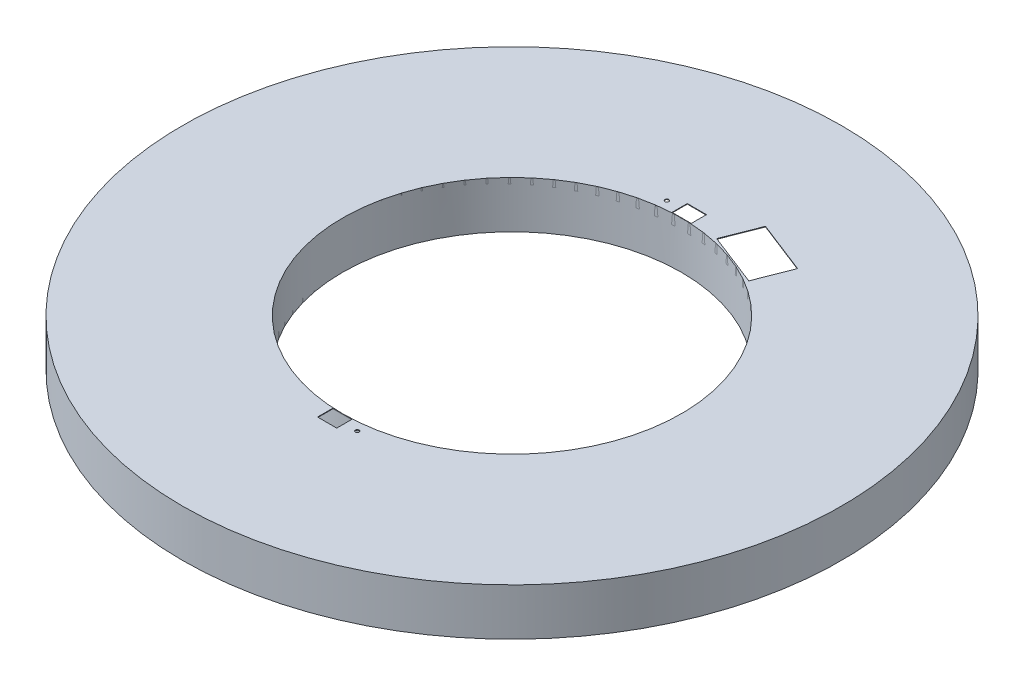
ISO-10303-21;
HEADER;
FILE_DESCRIPTION(('STEP AP214'),'2;1');
FILE_NAME('part.step','',(''),(''),'','','');
FILE_SCHEMA(('AUTOMOTIVE_DESIGN { 1 0 10303 214 1 1 1 1 }'));
ENDSEC;
DATA;
#1=APPLICATION_CONTEXT('core data for automotive mechanical design processes');
#2=APPLICATION_PROTOCOL_DEFINITION('international standard','automotive_design',2000,#1);
#3=PRODUCT_CONTEXT('',#1,'mechanical');
#4=PRODUCT('Part','Part','',(#3));
#5=PRODUCT_RELATED_PRODUCT_CATEGORY('part','',(#4));
#6=PRODUCT_DEFINITION_FORMATION('','',#4);
#7=PRODUCT_DEFINITION_CONTEXT('part definition',#1,'design');
#8=PRODUCT_DEFINITION('design','',#6,#7);
#9=PRODUCT_DEFINITION_SHAPE('','',#8);
#10=(LENGTH_UNIT() NAMED_UNIT(*) SI_UNIT(.MILLI.,.METRE.));
#11=(NAMED_UNIT(*) PLANE_ANGLE_UNIT() SI_UNIT($,.RADIAN.));
#12=(NAMED_UNIT(*) SI_UNIT($,.STERADIAN.) SOLID_ANGLE_UNIT());
#13=UNCERTAINTY_MEASURE_WITH_UNIT(LENGTH_MEASURE(1.E-05),#10,'distance_accuracy_value','');
#14=(GEOMETRIC_REPRESENTATION_CONTEXT(3) GLOBAL_UNCERTAINTY_ASSIGNED_CONTEXT((#13)) GLOBAL_UNIT_ASSIGNED_CONTEXT((#10,
#11,#12)) REPRESENTATION_CONTEXT('',''));
#15=CARTESIAN_POINT('',(0.,0.,0.));
#16=DIRECTION('',(0.,0.,1.));
#17=DIRECTION('',(1.,0.,0.));
#18=AXIS2_PLACEMENT_3D('',#15,#16,#17);
#19=CARTESIAN_POINT('',(0.,497.,0.));
#20=DIRECTION('',(0.,-1.,0.));
#21=DIRECTION('',(0.,0.,-1.));
#22=AXIS2_PLACEMENT_3D('',#19,#20,#21);
#23=CYLINDRICAL_SURFACE('',#22,1748.5);
#24=CARTESIAN_POINT('',(0.,497.,0.));
#25=DIRECTION('',(0.,-1.,0.));
#26=DIRECTION('',(0.,0.,-1.));
#27=AXIS2_PLACEMENT_3D('',#24,#25,#26);
#28=CIRCLE('',#27,1748.5);
#29=CARTESIAN_POINT('',(0.,497.,-1748.5));
#30=VERTEX_POINT('',#29);
#31=EDGE_CURVE('E252',#30,#30,#28,.T.);
#32=CARTESIAN_POINT('',(0.,250.,0.));
#33=DIRECTION('',(0.,-1.,0.));
#34=DIRECTION('',(0.,0.,-1.));
#35=AXIS2_PLACEMENT_3D('',#32,#33,#34);
#36=CIRCLE('',#35,1748.5);
#37=CARTESIAN_POINT('',(0.,250.,-1748.5));
#38=VERTEX_POINT('',#37);
#39=EDGE_CURVE('E235',#38,#38,#36,.F.);
#40=CARTESIAN_POINT('',(0.,497.,-1748.5));
#41=CARTESIAN_POINT('',(0.,494.427083333333,-1748.5));
#42=CARTESIAN_POINT('',(0.,491.854166666667,-1748.5));
#43=CARTESIAN_POINT('',(0.,486.708333333333,-1748.5));
#44=CARTESIAN_POINT('',(0.,484.135416666667,-1748.5));
#45=CARTESIAN_POINT('',(0.,478.989583333333,-1748.5));
#46=CARTESIAN_POINT('',(0.,476.416666666667,-1748.5));
#47=CARTESIAN_POINT('',(0.,471.270833333333,-1748.5));
#48=CARTESIAN_POINT('',(0.,468.697916666667,-1748.5));
#49=CARTESIAN_POINT('',(0.,463.552083333333,-1748.5));
#50=CARTESIAN_POINT('',(0.,460.979166666667,-1748.5));
#51=CARTESIAN_POINT('',(0.,455.833333333333,-1748.5));
#52=CARTESIAN_POINT('',(0.,453.260416666667,-1748.5));
#53=CARTESIAN_POINT('',(0.,448.114583333333,-1748.5));
#54=CARTESIAN_POINT('',(0.,445.541666666667,-1748.5));
#55=CARTESIAN_POINT('',(0.,440.395833333333,-1748.5));
#56=CARTESIAN_POINT('',(0.,437.822916666667,-1748.5));
#57=CARTESIAN_POINT('',(0.,432.677083333333,-1748.5));
#58=CARTESIAN_POINT('',(0.,430.104166666667,-1748.5));
#59=CARTESIAN_POINT('',(0.,424.958333333333,-1748.5));
#60=CARTESIAN_POINT('',(0.,422.385416666667,-1748.5));
#61=CARTESIAN_POINT('',(0.,417.239583333333,-1748.5));
#62=CARTESIAN_POINT('',(0.,414.666666666667,-1748.5));
#63=CARTESIAN_POINT('',(0.,409.520833333333,-1748.5));
#64=CARTESIAN_POINT('',(0.,406.947916666667,-1748.5));
#65=CARTESIAN_POINT('',(0.,401.802083333333,-1748.5));
#66=CARTESIAN_POINT('',(0.,399.229166666667,-1748.5));
#67=CARTESIAN_POINT('',(0.,394.083333333333,-1748.5));
#68=CARTESIAN_POINT('',(0.,391.510416666667,-1748.5));
#69=CARTESIAN_POINT('',(0.,386.364583333333,-1748.5));
#70=CARTESIAN_POINT('',(0.,383.791666666667,-1748.5));
#71=CARTESIAN_POINT('',(0.,378.645833333333,-1748.5));
#72=CARTESIAN_POINT('',(0.,376.072916666667,-1748.5));
#73=CARTESIAN_POINT('',(0.,370.927083333333,-1748.5));
#74=CARTESIAN_POINT('',(0.,368.354166666667,-1748.5));
#75=CARTESIAN_POINT('',(0.,363.208333333333,-1748.5));
#76=CARTESIAN_POINT('',(0.,360.635416666667,-1748.5));
#77=CARTESIAN_POINT('',(0.,355.489583333333,-1748.5));
#78=CARTESIAN_POINT('',(0.,352.916666666667,-1748.5));
#79=CARTESIAN_POINT('',(0.,347.770833333333,-1748.5));
#80=CARTESIAN_POINT('',(0.,345.197916666667,-1748.5));
#81=CARTESIAN_POINT('',(0.,340.052083333333,-1748.5));
#82=CARTESIAN_POINT('',(0.,337.479166666667,-1748.5));
#83=CARTESIAN_POINT('',(0.,332.333333333333,-1748.5));
#84=CARTESIAN_POINT('',(0.,329.760416666667,-1748.5));
#85=CARTESIAN_POINT('',(0.,324.614583333333,-1748.5));
#86=CARTESIAN_POINT('',(0.,322.041666666667,-1748.5));
#87=CARTESIAN_POINT('',(0.,316.895833333333,-1748.5));
#88=CARTESIAN_POINT('',(0.,314.322916666667,-1748.5));
#89=CARTESIAN_POINT('',(0.,309.177083333333,-1748.5));
#90=CARTESIAN_POINT('',(0.,306.604166666667,-1748.5));
#91=CARTESIAN_POINT('',(0.,301.458333333333,-1748.5));
#92=CARTESIAN_POINT('',(0.,298.885416666667,-1748.5));
#93=CARTESIAN_POINT('',(0.,293.739583333333,-1748.5));
#94=CARTESIAN_POINT('',(0.,291.166666666667,-1748.5));
#95=CARTESIAN_POINT('',(0.,286.020833333333,-1748.5));
#96=CARTESIAN_POINT('',(0.,283.447916666667,-1748.5));
#97=CARTESIAN_POINT('',(0.,278.302083333333,-1748.5));
#98=CARTESIAN_POINT('',(0.,275.729166666667,-1748.5));
#99=CARTESIAN_POINT('',(0.,270.583333333333,-1748.5));
#100=CARTESIAN_POINT('',(0.,268.010416666667,-1748.5));
#101=CARTESIAN_POINT('',(0.,262.864583333333,-1748.5));
#102=CARTESIAN_POINT('',(0.,260.291666666667,-1748.5));
#103=CARTESIAN_POINT('',(0.,255.145833333333,-1748.5));
#104=CARTESIAN_POINT('',(0.,252.572916666667,-1748.5));
#105=CARTESIAN_POINT('',(0.,250.,-1748.5));
#106=B_SPLINE_CURVE_WITH_KNOTS('',3,(#40,#41,#42,#43,#44,#45,#46,#47,#48,#49,#50,#51,#52,#53,
#54,#55,#56,#57,#58,#59,#60,#61,#62,#63,#64,#65,#66,#67,#68,#69,#70,#71,#72,#73,#74,#75,#76,#77,
#78,#79,#80,#81,#82,#83,#84,#85,#86,#87,#88,#89,#90,#91,#92,#93,#94,#95,#96,#97,#98,#99,#100,
#101,#102,#103,#104,#105),.UNSPECIFIED.,.F.,.F.,(4,2,2,2,2,2,2,2,2,2,2,2,2,2,2,2,2,2,2,2,2,2,2,
2,2,2,2,2,2,2,2,2,4),(0.,7.71875,15.4375,23.15625,30.875,38.59375,46.3125,54.03125,61.75,
69.46875,77.1875,84.90625,92.625,100.34375,108.0625,115.78125,123.5,131.21875,138.9375,
146.65625,154.375,162.09375,169.8125,177.53125,185.25,192.96875,200.6875,208.40625,216.125,
223.84375,231.5625,239.28125,247.),.UNSPECIFIED.);
#107=EDGE_CURVE('BSEAM38',#30,#38,#106,.T.);
#108=ORIENTED_EDGE('',*,*,#31,.F.);
#109=ORIENTED_EDGE('',*,*,#39,.F.);
#110=ORIENTED_EDGE('',*,*,#107,.T.);
#111=ORIENTED_EDGE('',*,*,#107,.F.);
#112=EDGE_LOOP('',(#108,#110,#109,#111));
#113=FACE_BOUND('',#112,.T.);
#114=ADVANCED_FACE('F38',(#113),#23,.F.);
#115=CARTESIAN_POINT('',(0.,497.,0.));
#116=DIRECTION('',(0.,-1.,0.));
#117=DIRECTION('',(0.,0.,-1.));
#118=AXIS2_PLACEMENT_3D('',#115,#116,#117);
#119=PLANE('',#118);
#120=DIRECTION('',(0.363730258472807,0.,-0.93150432047914));
#121=VECTOR('',#120,1.);
#122=CARTESIAN_POINT('',(188.594951023723,497.,-898.445391682458));
#123=LINE('',#122,#121);
#124=CARTESIAN_POINT('',(188.594951023723,497.,-898.445391682458));
#125=VERTEX_POINT('',#124);
#126=CARTESIAN_POINT('',(261.341002718284,497.,-1084.74625577829));
#127=VERTEX_POINT('',#126);
#128=EDGE_CURVE('E54',#125,#127,#123,.T.);
#129=ORIENTED_EDGE('',*,*,#128,.F.);
#130=DIRECTION('',(-0.93150432047914,0.,-0.363730258472807));
#131=VECTOR('',#130,1.);
#132=CARTESIAN_POINT('',(188.594951023723,497.,-898.445391682458));
#133=LINE('',#132,#131);
#134=CARTESIAN_POINT('',(468.046247167465,497.,-789.326314140616));
#135=VERTEX_POINT('',#134);
#136=EDGE_CURVE('E154',#135,#125,#133,.T.);
#137=ORIENTED_EDGE('',*,*,#136,.F.);
#138=DIRECTION('',(-0.363730258472807,0.,0.93150432047914));
#139=VECTOR('',#138,1.);
#140=CARTESIAN_POINT('',(468.046247167465,497.,-789.326314140616));
#141=LINE('',#140,#139);
#142=CARTESIAN_POINT('',(540.792298862026,497.,-975.627178236444));
#143=VERTEX_POINT('',#142);
#144=EDGE_CURVE('E136',#143,#135,#141,.T.);
#145=ORIENTED_EDGE('',*,*,#144,.F.);
#146=DIRECTION('',(0.93150432047914,0.,0.363730258472807));
#147=VECTOR('',#146,1.);
#148=CARTESIAN_POINT('',(261.341002718284,497.,-1084.74625577829));
#149=LINE('',#148,#147);
#150=EDGE_CURVE('E146',#127,#143,#149,.T.);
#151=ORIENTED_EDGE('',*,*,#150,.F.);
#152=EDGE_LOOP('',(#129,#137,#145,#151));
#153=FACE_BOUND('',#152,.T.);
#154=CARTESIAN_POINT('',(-118.818630958089,497.,-941.25));
#155=DIRECTION('',(0.,-1.,0.));
#156=DIRECTION('',(0.,0.,-1.));
#157=AXIS2_PLACEMENT_3D('',#154,#155,#156);
#158=CIRCLE('',#157,10.);
#159=CARTESIAN_POINT('',(-118.818630958089,497.,-951.25));
#160=VERTEX_POINT('',#159);
#161=EDGE_CURVE('E169',#160,#160,#158,.T.);
#162=ORIENTED_EDGE('',*,*,#161,.F.);
#163=EDGE_LOOP('',(#162));
#164=FACE_BOUND('',#163,.T.);
#165=CARTESIAN_POINT('',(119.300731454828,497.,941.189016636456));
#166=DIRECTION('',(0.,-1.,0.));
#167=DIRECTION('',(0.,0.,-1.));
#168=AXIS2_PLACEMENT_3D('',#165,#166,#167);
#169=CIRCLE('',#168,10.);
#170=CARTESIAN_POINT('',(119.300731454828,497.,931.189016636456));
#171=VERTEX_POINT('',#170);
#172=EDGE_CURVE('E164',#171,#171,#169,.T.);
#173=ORIENTED_EDGE('',*,*,#172,.F.);
#174=EDGE_LOOP('',(#173));
#175=FACE_BOUND('',#174,.T.);
#176=DIRECTION('',(0.,0.,1.));
#177=VECTOR('',#176,1.);
#178=CARTESIAN_POINT('',(51.,497.,-981.75));
#179=LINE('',#178,#177);
#180=CARTESIAN_POINT('',(51.,497.,-981.75));
#181=VERTEX_POINT('',#180);
#182=CARTESIAN_POINT('',(51.,497.,-900.75));
#183=VERTEX_POINT('',#182);
#184=EDGE_CURVE('E189',#181,#183,#179,.T.);
#185=ORIENTED_EDGE('',*,*,#184,.F.);
#186=DIRECTION('',(1.,0.,0.));
#187=VECTOR('',#186,1.);
#188=CARTESIAN_POINT('',(-51.,497.,-981.75));
#189=LINE('',#188,#187);
#190=CARTESIAN_POINT('',(-51.,497.,-981.75));
#191=VERTEX_POINT('',#190);
#192=EDGE_CURVE('E185',#191,#181,#189,.T.);
#193=ORIENTED_EDGE('',*,*,#192,.F.);
#194=DIRECTION('',(0.,0.,-1.));
#195=VECTOR('',#194,1.);
#196=CARTESIAN_POINT('',(-51.,497.,-900.75));
#197=LINE('',#196,#195);
#198=CARTESIAN_POINT('',(-51.,497.,-900.75));
#199=VERTEX_POINT('',#198);
#200=EDGE_CURVE('E180',#199,#191,#197,.T.);
#201=ORIENTED_EDGE('',*,*,#200,.F.);
#202=DIRECTION('',(-1.,0.,0.));
#203=VECTOR('',#202,1.);
#204=CARTESIAN_POINT('',(0.,497.,-900.75));
#205=LINE('',#204,#203);
#206=CARTESIAN_POINT('',(0.,497.,-900.75));
#207=VERTEX_POINT('',#206);
#208=EDGE_CURVE('E181',#207,#199,#205,.T.);
#209=ORIENTED_EDGE('',*,*,#208,.F.);
#210=CARTESIAN_POINT('',(0.,497.,0.));
#211=DIRECTION('',(0.,-1.,0.));
#212=DIRECTION('',(0.,0.,-1.));
#213=AXIS2_PLACEMENT_3D('',#210,#211,#212);
#214=CIRCLE('',#213,900.75);
#215=CARTESIAN_POINT('',(0.,497.,900.75));
#216=VERTEX_POINT('',#215);
#217=EDGE_CURVE('E248',#216,#207,#214,.T.);
#218=ORIENTED_EDGE('',*,*,#217,.F.);
#219=DIRECTION('',(1.,0.,0.));
#220=VECTOR('',#219,1.);
#221=CARTESIAN_POINT('',(0.,497.,900.75));
#222=LINE('',#221,#220);
#223=CARTESIAN_POINT('',(-51.,497.,900.75));
#224=VERTEX_POINT('',#223);
#225=EDGE_CURVE('E206',#224,#216,#222,.T.);
#226=ORIENTED_EDGE('',*,*,#225,.F.);
#227=DIRECTION('',(0.,0.,-1.));
#228=VECTOR('',#227,1.);
#229=CARTESIAN_POINT('',(-51.,497.,981.75));
#230=LINE('',#229,#228);
#231=CARTESIAN_POINT('',(-51.,497.,981.75));
#232=VERTEX_POINT('',#231);
#233=EDGE_CURVE('E217',#232,#224,#230,.T.);
#234=ORIENTED_EDGE('',*,*,#233,.F.);
#235=DIRECTION('',(-1.,0.,0.));
#236=VECTOR('',#235,1.);
#237=CARTESIAN_POINT('',(51.,497.,981.75));
#238=LINE('',#237,#236);
#239=CARTESIAN_POINT('',(51.,497.,981.75));
#240=VERTEX_POINT('',#239);
#241=EDGE_CURVE('E213',#240,#232,#238,.T.);
#242=ORIENTED_EDGE('',*,*,#241,.F.);
#243=DIRECTION('',(0.,0.,1.));
#244=VECTOR('',#243,1.);
#245=CARTESIAN_POINT('',(51.,497.,900.75));
#246=LINE('',#245,#244);
#247=CARTESIAN_POINT('',(51.,497.,900.75));
#248=VERTEX_POINT('',#247);
#249=EDGE_CURVE('E210',#248,#240,#246,.T.);
#250=ORIENTED_EDGE('',*,*,#249,.F.);
#251=EDGE_CURVE('E197',#216,#248,#222,.T.);
#252=ORIENTED_EDGE('',*,*,#251,.F.);
#253=EDGE_CURVE('E247',#207,#216,#214,.T.);
#254=ORIENTED_EDGE('',*,*,#253,.F.);
#255=EDGE_CURVE('E177',#183,#207,#205,.T.);
#256=ORIENTED_EDGE('',*,*,#255,.F.);
#257=EDGE_LOOP('',(#185,#193,#201,#209,#218,#226,#234,#242,#250,#252,#254,#256));
#258=FACE_BOUND('',#257,.T.);
#259=ORIENTED_EDGE('',*,*,#31,.T.);
#260=EDGE_LOOP('',(#259));
#261=FACE_BOUND('',#260,.T.);
#262=ADVANCED_FACE('F151',(#153,#164,#175,#258,#261),#119,.T.);
#263=CARTESIAN_POINT('',(0.,497.,0.));
#264=DIRECTION('',(0.,-1.,0.));
#265=DIRECTION('',(0.,0.,-1.));
#266=AXIS2_PLACEMENT_3D('',#263,#264,#265);
#267=CYLINDRICAL_SURFACE('',#266,900.75);
#268=ORIENTED_EDGE('',*,*,#217,.T.);
#269=ORIENTED_EDGE('',*,*,#253,.T.);
#270=EDGE_LOOP('',(#268,#269));
#271=FACE_BOUND('',#270,.T.);
#272=CARTESIAN_POINT('',(0.,250.,0.));
#273=DIRECTION('',(0.,-1.,0.));
#274=DIRECTION('',(0.,0.,-1.));
#275=AXIS2_PLACEMENT_3D('',#272,#273,#274);
#276=CIRCLE('',#275,900.75);
#277=CARTESIAN_POINT('',(0.,250.,-900.75));
#278=VERTEX_POINT('',#277);
#279=EDGE_CURVE('E225',#278,#278,#276,.F.);
#280=ORIENTED_EDGE('',*,*,#279,.T.);
#281=EDGE_LOOP('',(#280));
#282=FACE_BOUND('',#281,.T.);
#283=ADVANCED_FACE('F334',(#271,#282),#267,.T.);
#284=CARTESIAN_POINT('',(0.,250.,-1750.));
#285=DIRECTION('',(0.,-1.,0.));
#286=DIRECTION('',(0.,0.,-1.));
#287=AXIS2_PLACEMENT_3D('',#284,#285,#286);
#288=PLANE('',#287);
#289=ORIENTED_EDGE('',*,*,#279,.F.);
#290=EDGE_LOOP('',(#289));
#291=FACE_BOUND('',#290,.T.);
#292=CARTESIAN_POINT('',(0.,250.,0.));
#293=DIRECTION('',(0.,-1.,0.));
#294=DIRECTION('',(0.,0.,-1.));
#295=AXIS2_PLACEMENT_3D('',#292,#293,#294);
#296=CIRCLE('',#295,900.);
#297=CARTESIAN_POINT('',(0.,250.,-900.));
#298=VERTEX_POINT('',#297);
#299=EDGE_CURVE('E239',#298,#298,#296,.F.);
#300=ORIENTED_EDGE('',*,*,#299,.T.);
#301=EDGE_LOOP('',(#300));
#302=FACE_BOUND('',#301,.T.);
#303=ADVANCED_FACE('F371',(#291,#302),#288,.T.);
#304=ORIENTED_EDGE('',*,*,#39,.T.);
#305=EDGE_LOOP('',(#304));
#306=FACE_BOUND('',#305,.T.);
#307=CARTESIAN_POINT('',(0.,250.,0.));
#308=DIRECTION('',(0.,-1.,0.));
#309=DIRECTION('',(0.,0.,-1.));
#310=AXIS2_PLACEMENT_3D('',#307,#308,#309);
#311=CIRCLE('',#310,1750.);
#312=CARTESIAN_POINT('',(0.,250.,-1750.));
#313=VERTEX_POINT('',#312);
#314=EDGE_CURVE('E243',#313,#313,#311,.T.);
#315=ORIENTED_EDGE('',*,*,#314,.T.);
#316=EDGE_LOOP('',(#315));
#317=FACE_BOUND('',#316,.T.);
#318=ADVANCED_FACE('F369',(#306,#317),#288,.T.);
#319=CARTESIAN_POINT('',(0.,500.,0.));
#320=DIRECTION('',(0.,-1.,0.));
#321=DIRECTION('',(0.,0.,-1.));
#322=AXIS2_PLACEMENT_3D('',#319,#320,#321);
#323=CYLINDRICAL_SURFACE('',#322,1750.);
#324=CARTESIAN_POINT('',(0.,500.,0.));
#325=DIRECTION('',(0.,1.,0.));
#326=DIRECTION('',(0.,0.,1.));
#327=AXIS2_PLACEMENT_3D('',#324,#325,#326);
#328=CIRCLE('',#327,1750.);
#329=CARTESIAN_POINT('',(0.,500.,1750.));
#330=VERTEX_POINT('',#329);
#331=EDGE_CURVE('E260',#330,#330,#328,.T.);
#332=ORIENTED_EDGE('',*,*,#331,.F.);
#333=EDGE_LOOP('',(#332));
#334=FACE_BOUND('',#333,.T.);
#335=ORIENTED_EDGE('',*,*,#314,.F.);
#336=EDGE_LOOP('',(#335));
#337=FACE_BOUND('',#336,.T.);
#338=ADVANCED_FACE('F40',(#334,#337),#323,.T.);
#339=CARTESIAN_POINT('',(0.,200.,0.));
#340=DIRECTION('',(0.,1.,0.));
#341=DIRECTION('',(0.,0.,1.));
#342=AXIS2_PLACEMENT_3D('',#339,#340,#341);
#343=CYLINDRICAL_SURFACE('',#342,900.);
#344=CARTESIAN_POINT('',(0.,500.,0.));
#345=DIRECTION('',(0.,1.,0.));
#346=DIRECTION('',(0.,0.,1.));
#347=AXIS2_PLACEMENT_3D('',#344,#345,#346);
#348=CIRCLE('',#347,900.);
#349=CARTESIAN_POINT('',(0.,500.,900.));
#350=VERTEX_POINT('',#349);
#351=EDGE_CURVE('E256',#350,#350,#348,.T.);
#352=ORIENTED_EDGE('',*,*,#351,.T.);
#353=EDGE_LOOP('',(#352));
#354=FACE_BOUND('',#353,.T.);
#355=ORIENTED_EDGE('',*,*,#299,.F.);
#356=EDGE_LOOP('',(#355));
#357=FACE_BOUND('',#356,.T.);
#358=ADVANCED_FACE('F340',(#354,#357),#343,.F.);
#359=CARTESIAN_POINT('',(0.,500.,0.));
#360=DIRECTION('',(0.,1.,0.));
#361=DIRECTION('',(0.,0.,1.));
#362=AXIS2_PLACEMENT_3D('',#359,#360,#361);
#363=PLANE('',#362);
#364=DIRECTION('',(-0.363730258472807,0.,0.93150432047914));
#365=VECTOR('',#364,1.);
#366=CARTESIAN_POINT('',(-140.764054474771,500.,-54.9650117472916));
#367=LINE('',#366,#365);
#368=CARTESIAN_POINT('',(261.341002718284,500.,-1084.74625577829));
#369=VERTEX_POINT('',#368);
#370=CARTESIAN_POINT('',(188.594951023723,500.,-898.445391682458));
#371=VERTEX_POINT('',#370);
#372=EDGE_CURVE('E11',#369,#371,#367,.T.);
#373=ORIENTED_EDGE('',*,*,#372,.F.);
#374=DIRECTION('',(-0.93150432047914,0.,-0.363730258472807));
#375=VECTOR('',#374,1.);
#376=CARTESIAN_POINT('',(402.105057193055,500.,-1029.78124403099));
#377=LINE('',#376,#375);
#378=CARTESIAN_POINT('',(540.792298862026,500.,-975.627178236444));
#379=VERTEX_POINT('',#378);
#380=EDGE_CURVE('E293',#379,#369,#377,.T.);
#381=ORIENTED_EDGE('',*,*,#380,.F.);
#382=DIRECTION('',(0.363730258472807,0.,-0.93150432047914));
#383=VECTOR('',#382,1.);
#384=CARTESIAN_POINT('',(138.687241668971,500.,54.1540657945506));
#385=LINE('',#384,#383);
#386=CARTESIAN_POINT('',(468.046247167465,500.,-789.326314140616));
#387=VERTEX_POINT('',#386);
#388=EDGE_CURVE('E139',#387,#379,#385,.T.);
#389=ORIENTED_EDGE('',*,*,#388,.F.);
#390=DIRECTION('',(0.93150432047914,0.,0.363730258472807));
#391=VECTOR('',#390,1.);
#392=CARTESIAN_POINT('',(329.359005498494,500.,-843.480379935167));
#393=LINE('',#392,#391);
#394=EDGE_CURVE('E47',#371,#387,#393,.T.);
#395=ORIENTED_EDGE('',*,*,#394,.F.);
#396=EDGE_LOOP('',(#373,#381,#389,#395));
#397=FACE_BOUND('',#396,.T.);
#398=CARTESIAN_POINT('',(-118.818630958089,500.,-941.25));
#399=DIRECTION('',(0.,1.,0.));
#400=DIRECTION('',(0.,0.,1.));
#401=AXIS2_PLACEMENT_3D('',#398,#399,#400);
#402=CIRCLE('',#401,10.);
#403=CARTESIAN_POINT('',(-118.818630958089,500.,-931.25));
#404=VERTEX_POINT('',#403);
#405=EDGE_CURVE('E297',#404,#404,#402,.T.);
#406=ORIENTED_EDGE('',*,*,#405,.F.);
#407=EDGE_LOOP('',(#406));
#408=FACE_BOUND('',#407,.T.);
#409=CARTESIAN_POINT('',(119.300731454828,500.,941.189016636456));
#410=DIRECTION('',(0.,1.,0.));
#411=DIRECTION('',(0.,0.,1.));
#412=AXIS2_PLACEMENT_3D('',#409,#410,#411);
#413=CIRCLE('',#412,10.);
#414=CARTESIAN_POINT('',(119.300731454828,500.,951.189016636456));
#415=VERTEX_POINT('',#414);
#416=EDGE_CURVE('E173',#415,#415,#413,.T.);
#417=ORIENTED_EDGE('',*,*,#416,.F.);
#418=EDGE_LOOP('',(#417));
#419=FACE_BOUND('',#418,.T.);
#420=DIRECTION('',(0.,0.,-1.));
#421=VECTOR('',#420,1.);
#422=CARTESIAN_POINT('',(51.,500.,0.));
#423=LINE('',#422,#421);
#424=CARTESIAN_POINT('',(51.,500.,-900.75));
#425=VERTEX_POINT('',#424);
#426=CARTESIAN_POINT('',(51.,500.,-981.75));
#427=VERTEX_POINT('',#426);
#428=EDGE_CURVE('E290',#425,#427,#423,.T.);
#429=ORIENTED_EDGE('',*,*,#428,.F.);
#430=DIRECTION('',(1.,0.,0.));
#431=VECTOR('',#430,1.);
#432=CARTESIAN_POINT('',(0.,500.,-900.75));
#433=LINE('',#432,#431);
#434=CARTESIAN_POINT('',(-51.,500.,-900.75));
#435=VERTEX_POINT('',#434);
#436=EDGE_CURVE('E280',#435,#425,#433,.T.);
#437=ORIENTED_EDGE('',*,*,#436,.F.);
#438=DIRECTION('',(0.,0.,1.));
#439=VECTOR('',#438,1.);
#440=CARTESIAN_POINT('',(-51.,500.,0.));
#441=LINE('',#440,#439);
#442=CARTESIAN_POINT('',(-51.,500.,-981.75));
#443=VERTEX_POINT('',#442);
#444=EDGE_CURVE('E283',#443,#435,#441,.T.);
#445=ORIENTED_EDGE('',*,*,#444,.F.);
#446=DIRECTION('',(-1.,0.,0.));
#447=VECTOR('',#446,1.);
#448=CARTESIAN_POINT('',(0.,500.,-981.75));
#449=LINE('',#448,#447);
#450=EDGE_CURVE('E287',#427,#443,#449,.T.);
#451=ORIENTED_EDGE('',*,*,#450,.F.);
#452=EDGE_LOOP('',(#429,#437,#445,#451));
#453=FACE_BOUND('',#452,.T.);
#454=DIRECTION('',(0.,0.,1.));
#455=VECTOR('',#454,1.);
#456=CARTESIAN_POINT('',(-51.,500.,0.));
#457=LINE('',#456,#455);
#458=CARTESIAN_POINT('',(-51.,500.,900.75));
#459=VERTEX_POINT('',#458);
#460=CARTESIAN_POINT('',(-51.,500.,981.75));
#461=VERTEX_POINT('',#460);
#462=EDGE_CURVE('E277',#459,#461,#457,.T.);
#463=ORIENTED_EDGE('',*,*,#462,.F.);
#464=DIRECTION('',(-1.,0.,0.));
#465=VECTOR('',#464,1.);
#466=CARTESIAN_POINT('',(0.,500.,900.75));
#467=LINE('',#466,#465);
#468=CARTESIAN_POINT('',(51.,500.,900.75));
#469=VERTEX_POINT('',#468);
#470=EDGE_CURVE('E264',#469,#459,#467,.T.);
#471=ORIENTED_EDGE('',*,*,#470,.F.);
#472=DIRECTION('',(0.,0.,-1.));
#473=VECTOR('',#472,1.);
#474=CARTESIAN_POINT('',(51.,500.,0.));
#475=LINE('',#474,#473);
#476=CARTESIAN_POINT('',(51.,500.,981.75));
#477=VERTEX_POINT('',#476);
#478=EDGE_CURVE('E270',#477,#469,#475,.T.);
#479=ORIENTED_EDGE('',*,*,#478,.F.);
#480=DIRECTION('',(1.,0.,0.));
#481=VECTOR('',#480,1.);
#482=CARTESIAN_POINT('',(0.,500.,981.75));
#483=LINE('',#482,#481);
#484=EDGE_CURVE('E274',#461,#477,#483,.T.);
#485=ORIENTED_EDGE('',*,*,#484,.F.);
#486=EDGE_LOOP('',(#463,#471,#479,#485));
#487=FACE_BOUND('',#486,.T.);
#488=ORIENTED_EDGE('',*,*,#351,.F.);
#489=EDGE_LOOP('',(#488));
#490=FACE_BOUND('',#489,.T.);
#491=ORIENTED_EDGE('',*,*,#331,.T.);
#492=EDGE_LOOP('',(#491));
#493=FACE_BOUND('',#492,.T.);
#494=ADVANCED_FACE('F311',(#397,#408,#419,#453,#487,#490,#493),#363,.T.);
#495=CARTESIAN_POINT('',(-51.,507.,981.75));
#496=DIRECTION('',(-1.,0.,0.));
#497=DIRECTION('',(0.,0.,1.));
#498=AXIS2_PLACEMENT_3D('',#495,#496,#497);
#499=PLANE('',#498);
#500=ORIENTED_EDGE('',*,*,#462,.T.);
#501=DIRECTION('',(0.,-1.,0.));
#502=VECTOR('',#501,1.);
#503=CARTESIAN_POINT('',(-51.,507.,981.75));
#504=LINE('',#503,#502);
#505=EDGE_CURVE('E226',#461,#232,#504,.T.);
#506=ORIENTED_EDGE('',*,*,#505,.T.);
#507=ORIENTED_EDGE('',*,*,#233,.T.);
#508=DIRECTION('',(0.,-1.,0.));
#509=VECTOR('',#508,1.);
#510=CARTESIAN_POINT('',(-51.,507.,900.75));
#511=LINE('',#510,#509);
#512=EDGE_CURVE('E222',#459,#224,#511,.T.);
#513=ORIENTED_EDGE('',*,*,#512,.F.);
#514=EDGE_LOOP('',(#500,#506,#507,#513));
#515=FACE_BOUND('',#514,.T.);
#516=ADVANCED_FACE('F344',(#515),#499,.F.);
#517=CARTESIAN_POINT('',(51.,507.,981.75));
#518=DIRECTION('',(0.,0.,1.));
#519=DIRECTION('',(1.,0.,0.));
#520=AXIS2_PLACEMENT_3D('',#517,#518,#519);
#521=PLANE('',#520);
#522=ORIENTED_EDGE('',*,*,#484,.T.);
#523=DIRECTION('',(0.,-1.,0.));
#524=VECTOR('',#523,1.);
#525=CARTESIAN_POINT('',(51.,507.,981.75));
#526=LINE('',#525,#524);
#527=EDGE_CURVE('E229',#477,#240,#526,.T.);
#528=ORIENTED_EDGE('',*,*,#527,.T.);
#529=ORIENTED_EDGE('',*,*,#241,.T.);
#530=ORIENTED_EDGE('',*,*,#505,.F.);
#531=EDGE_LOOP('',(#522,#528,#529,#530));
#532=FACE_BOUND('',#531,.T.);
#533=ADVANCED_FACE('F348',(#532),#521,.F.);
#534=CARTESIAN_POINT('',(51.,507.,900.75));
#535=DIRECTION('',(1.,0.,0.));
#536=DIRECTION('',(0.,0.,-1.));
#537=AXIS2_PLACEMENT_3D('',#534,#535,#536);
#538=PLANE('',#537);
#539=ORIENTED_EDGE('',*,*,#478,.T.);
#540=DIRECTION('',(0.,-1.,0.));
#541=VECTOR('',#540,1.);
#542=CARTESIAN_POINT('',(51.,507.,900.75));
#543=LINE('',#542,#541);
#544=EDGE_CURVE('E221',#469,#248,#543,.T.);
#545=ORIENTED_EDGE('',*,*,#544,.T.);
#546=ORIENTED_EDGE('',*,*,#249,.T.);
#547=ORIENTED_EDGE('',*,*,#527,.F.);
#548=EDGE_LOOP('',(#539,#545,#546,#547));
#549=FACE_BOUND('',#548,.T.);
#550=ADVANCED_FACE('F354',(#549),#538,.F.);
#551=CARTESIAN_POINT('',(0.,507.,900.75));
#552=DIRECTION('',(0.,0.,-1.));
#553=DIRECTION('',(-1.,0.,0.));
#554=AXIS2_PLACEMENT_3D('',#551,#552,#553);
#555=PLANE('',#554);
#556=ORIENTED_EDGE('',*,*,#470,.T.);
#557=ORIENTED_EDGE('',*,*,#512,.T.);
#558=ORIENTED_EDGE('',*,*,#225,.T.);
#559=ORIENTED_EDGE('',*,*,#251,.T.);
#560=ORIENTED_EDGE('',*,*,#544,.F.);
#561=EDGE_LOOP('',(#556,#557,#558,#559,#560));
#562=FACE_BOUND('',#561,.T.);
#563=ADVANCED_FACE('F363',(#562),#555,.F.);
#564=CARTESIAN_POINT('',(51.,507.,-981.75));
#565=DIRECTION('',(1.,0.,0.));
#566=DIRECTION('',(0.,0.,-1.));
#567=AXIS2_PLACEMENT_3D('',#564,#565,#566);
#568=PLANE('',#567);
#569=ORIENTED_EDGE('',*,*,#428,.T.);
#570=DIRECTION('',(0.,-1.,0.));
#571=VECTOR('',#570,1.);
#572=CARTESIAN_POINT('',(51.,507.,-981.75));
#573=LINE('',#572,#571);
#574=EDGE_CURVE('E198',#427,#181,#573,.T.);
#575=ORIENTED_EDGE('',*,*,#574,.T.);
#576=ORIENTED_EDGE('',*,*,#184,.T.);
#577=DIRECTION('',(0.,-1.,0.));
#578=VECTOR('',#577,1.);
#579=CARTESIAN_POINT('',(51.,507.,-900.75));
#580=LINE('',#579,#578);
#581=EDGE_CURVE('E194',#425,#183,#580,.T.);
#582=ORIENTED_EDGE('',*,*,#581,.F.);
#583=EDGE_LOOP('',(#569,#575,#576,#582));
#584=FACE_BOUND('',#583,.T.);
#585=ADVANCED_FACE('F367',(#584),#568,.F.);
#586=CARTESIAN_POINT('',(-51.,507.,-981.75));
#587=DIRECTION('',(0.,0.,-1.));
#588=DIRECTION('',(-1.,0.,0.));
#589=AXIS2_PLACEMENT_3D('',#586,#587,#588);
#590=PLANE('',#589);
#591=ORIENTED_EDGE('',*,*,#450,.T.);
#592=DIRECTION('',(0.,-1.,0.));
#593=VECTOR('',#592,1.);
#594=CARTESIAN_POINT('',(-51.,507.,-981.75));
#595=LINE('',#594,#593);
#596=EDGE_CURVE('E201',#443,#191,#595,.T.);
#597=ORIENTED_EDGE('',*,*,#596,.T.);
#598=ORIENTED_EDGE('',*,*,#192,.T.);
#599=ORIENTED_EDGE('',*,*,#574,.F.);
#600=EDGE_LOOP('',(#591,#597,#598,#599));
#601=FACE_BOUND('',#600,.T.);
#602=ADVANCED_FACE('F494',(#601),#590,.F.);
#603=CARTESIAN_POINT('',(-51.,507.,-900.75));
#604=DIRECTION('',(-1.,0.,0.));
#605=DIRECTION('',(0.,0.,1.));
#606=AXIS2_PLACEMENT_3D('',#603,#604,#605);
#607=PLANE('',#606);
#608=ORIENTED_EDGE('',*,*,#444,.T.);
#609=DIRECTION('',(0.,-1.,0.));
#610=VECTOR('',#609,1.);
#611=CARTESIAN_POINT('',(-51.,507.,-900.75));
#612=LINE('',#611,#610);
#613=EDGE_CURVE('E193',#435,#199,#612,.T.);
#614=ORIENTED_EDGE('',*,*,#613,.T.);
#615=ORIENTED_EDGE('',*,*,#200,.T.);
#616=ORIENTED_EDGE('',*,*,#596,.F.);
#617=EDGE_LOOP('',(#608,#614,#615,#616));
#618=FACE_BOUND('',#617,.T.);
#619=ADVANCED_FACE('F503',(#618),#607,.F.);
#620=CARTESIAN_POINT('',(0.,507.,-900.75));
#621=DIRECTION('',(0.,0.,1.));
#622=DIRECTION('',(1.,0.,0.));
#623=AXIS2_PLACEMENT_3D('',#620,#621,#622);
#624=PLANE('',#623);
#625=ORIENTED_EDGE('',*,*,#436,.T.);
#626=ORIENTED_EDGE('',*,*,#581,.T.);
#627=ORIENTED_EDGE('',*,*,#255,.T.);
#628=ORIENTED_EDGE('',*,*,#208,.T.);
#629=ORIENTED_EDGE('',*,*,#613,.F.);
#630=EDGE_LOOP('',(#625,#626,#627,#628,#629));
#631=FACE_BOUND('',#630,.T.);
#632=ADVANCED_FACE('F358',(#631),#624,.F.);
#633=CARTESIAN_POINT('',(119.300731454828,507.,941.189016636456));
#634=DIRECTION('',(0.,-1.,0.));
#635=DIRECTION('',(0.,0.,-1.));
#636=AXIS2_PLACEMENT_3D('',#633,#634,#635);
#637=CYLINDRICAL_SURFACE('',#636,10.);
#638=ORIENTED_EDGE('',*,*,#416,.T.);
#639=EDGE_LOOP('',(#638));
#640=FACE_BOUND('',#639,.T.);
#641=ORIENTED_EDGE('',*,*,#172,.T.);
#642=EDGE_LOOP('',(#641));
#643=FACE_BOUND('',#642,.T.);
#644=ADVANCED_FACE('F323',(#640,#643),#637,.F.);
#645=CARTESIAN_POINT('',(-118.818630958089,507.,-941.25));
#646=DIRECTION('',(0.,-1.,0.));
#647=DIRECTION('',(0.,0.,-1.));
#648=AXIS2_PLACEMENT_3D('',#645,#646,#647);
#649=CYLINDRICAL_SURFACE('',#648,10.);
#650=ORIENTED_EDGE('',*,*,#405,.T.);
#651=EDGE_LOOP('',(#650));
#652=FACE_BOUND('',#651,.T.);
#653=ORIENTED_EDGE('',*,*,#161,.T.);
#654=EDGE_LOOP('',(#653));
#655=FACE_BOUND('',#654,.T.);
#656=ADVANCED_FACE('F316',(#652,#655),#649,.F.);
#657=CARTESIAN_POINT('',(188.594951023723,507.,-898.445391682458));
#658=DIRECTION('',(-0.93150432047914,0.,-0.363730258472807));
#659=DIRECTION('',(-0.363730258472807,0.,0.93150432047914));
#660=AXIS2_PLACEMENT_3D('',#657,#658,#659);
#661=PLANE('',#660);
#662=ORIENTED_EDGE('',*,*,#372,.T.);
#663=DIRECTION('',(0.,-1.,0.));
#664=VECTOR('',#663,1.);
#665=CARTESIAN_POINT('',(188.594951023723,507.,-898.445391682458));
#666=LINE('',#665,#664);
#667=EDGE_CURVE('E161',#371,#125,#666,.T.);
#668=ORIENTED_EDGE('',*,*,#667,.T.);
#669=ORIENTED_EDGE('',*,*,#128,.T.);
#670=DIRECTION('',(0.,-1.,0.));
#671=VECTOR('',#670,1.);
#672=CARTESIAN_POINT('',(261.341002718284,507.,-1084.74625577829));
#673=LINE('',#672,#671);
#674=EDGE_CURVE('E143',#369,#127,#673,.T.);
#675=ORIENTED_EDGE('',*,*,#674,.F.);
#676=EDGE_LOOP('',(#662,#668,#669,#675));
#677=FACE_BOUND('',#676,.T.);
#678=ADVANCED_FACE('F313',(#677),#661,.F.);
#679=CARTESIAN_POINT('',(188.594951023723,507.,-898.445391682458));
#680=DIRECTION('',(-0.363730258472807,0.,0.93150432047914));
#681=DIRECTION('',(0.93150432047914,0.,0.363730258472807));
#682=AXIS2_PLACEMENT_3D('',#679,#680,#681);
#683=PLANE('',#682);
#684=ORIENTED_EDGE('',*,*,#394,.T.);
#685=DIRECTION('',(0.,-1.,0.));
#686=VECTOR('',#685,1.);
#687=CARTESIAN_POINT('',(468.046247167465,507.,-789.326314140616));
#688=LINE('',#687,#686);
#689=EDGE_CURVE('E142',#387,#135,#688,.T.);
#690=ORIENTED_EDGE('',*,*,#689,.T.);
#691=ORIENTED_EDGE('',*,*,#136,.T.);
#692=ORIENTED_EDGE('',*,*,#667,.F.);
#693=EDGE_LOOP('',(#684,#690,#691,#692));
#694=FACE_BOUND('',#693,.T.);
#695=ADVANCED_FACE('F308',(#694),#683,.F.);
#696=CARTESIAN_POINT('',(468.046247167465,507.,-789.326314140616));
#697=DIRECTION('',(0.93150432047914,0.,0.363730258472807));
#698=DIRECTION('',(0.363730258472807,0.,-0.93150432047914));
#699=AXIS2_PLACEMENT_3D('',#696,#697,#698);
#700=PLANE('',#699);
#701=ORIENTED_EDGE('',*,*,#388,.T.);
#702=DIRECTION('',(0.,-1.,0.));
#703=VECTOR('',#702,1.);
#704=CARTESIAN_POINT('',(540.792298862026,507.,-975.627178236444));
#705=LINE('',#704,#703);
#706=EDGE_CURVE('E62',#379,#143,#705,.T.);
#707=ORIENTED_EDGE('',*,*,#706,.T.);
#708=ORIENTED_EDGE('',*,*,#144,.T.);
#709=ORIENTED_EDGE('',*,*,#689,.F.);
#710=EDGE_LOOP('',(#701,#707,#708,#709));
#711=FACE_BOUND('',#710,.T.);
#712=ADVANCED_FACE('F133',(#711),#700,.F.);
#713=CARTESIAN_POINT('',(261.341002718284,507.,-1084.74625577829));
#714=DIRECTION('',(0.363730258472807,0.,-0.93150432047914));
#715=DIRECTION('',(-0.93150432047914,0.,-0.363730258472807));
#716=AXIS2_PLACEMENT_3D('',#713,#714,#715);
#717=PLANE('',#716);
#718=ORIENTED_EDGE('',*,*,#380,.T.);
#719=ORIENTED_EDGE('',*,*,#674,.T.);
#720=ORIENTED_EDGE('',*,*,#150,.T.);
#721=ORIENTED_EDGE('',*,*,#706,.F.);
#722=EDGE_LOOP('',(#718,#719,#720,#721));
#723=FACE_BOUND('',#722,.T.);
#724=ADVANCED_FACE('F147',(#723),#717,.F.);
#725=CLOSED_SHELL('',(#114,#262,#283,#303,#318,#338,#358,#494,#516,#533,#550,#563,#585,#602,
#619,#632,#644,#656,#678,#695,#712,#724));
#726=MANIFOLD_SOLID_BREP('B2',#725);
#727=ADVANCED_BREP_SHAPE_REPRESENTATION('',(#18,#726),#14);
#728=SHAPE_DEFINITION_REPRESENTATION(#9,#727);
ENDSEC;
END-ISO-10303-21;
